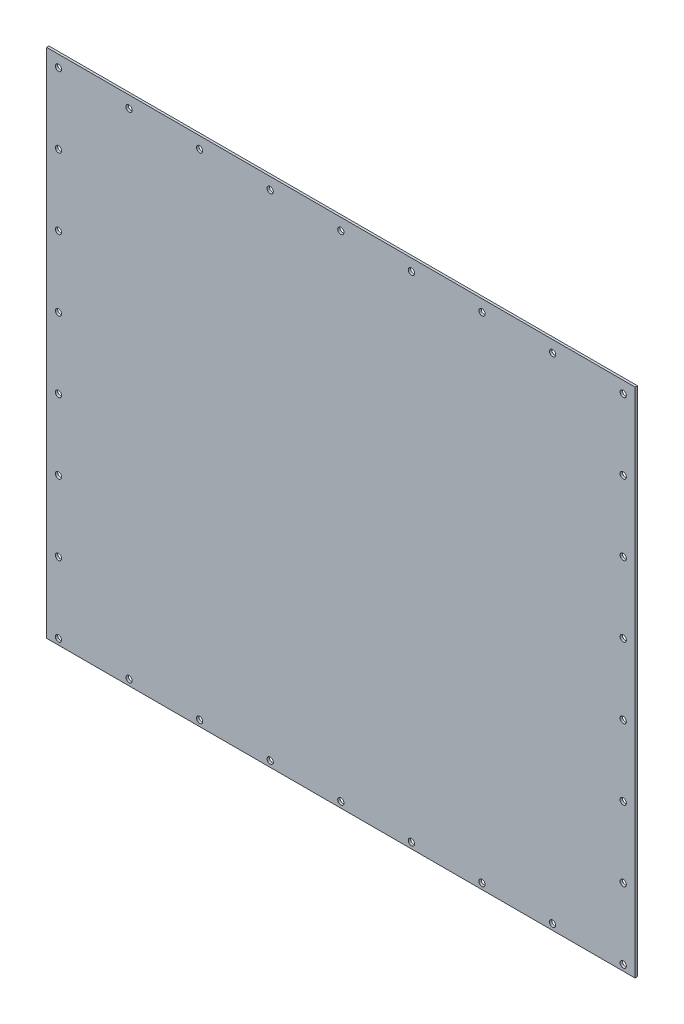
ISO-10303-21;
HEADER;
FILE_DESCRIPTION(('STEP AP214'),'2;1');
FILE_NAME('part.step','',(''),(''),'','','');
FILE_SCHEMA(('AUTOMOTIVE_DESIGN { 1 0 10303 214 1 1 1 1 }'));
ENDSEC;
DATA;
#1=APPLICATION_CONTEXT('core data for automotive mechanical design processes');
#2=APPLICATION_PROTOCOL_DEFINITION('international standard','automotive_design',2000,#1);
#3=PRODUCT_CONTEXT('',#1,'mechanical');
#4=PRODUCT('Part','Part','',(#3));
#5=PRODUCT_RELATED_PRODUCT_CATEGORY('part','',(#4));
#6=PRODUCT_DEFINITION_FORMATION('','',#4);
#7=PRODUCT_DEFINITION_CONTEXT('part definition',#1,'design');
#8=PRODUCT_DEFINITION('design','',#6,#7);
#9=PRODUCT_DEFINITION_SHAPE('','',#8);
#10=(LENGTH_UNIT() NAMED_UNIT(*) SI_UNIT(.MILLI.,.METRE.));
#11=(NAMED_UNIT(*) PLANE_ANGLE_UNIT() SI_UNIT($,.RADIAN.));
#12=(NAMED_UNIT(*) SI_UNIT($,.STERADIAN.) SOLID_ANGLE_UNIT());
#13=UNCERTAINTY_MEASURE_WITH_UNIT(LENGTH_MEASURE(1.E-05),#10,'distance_accuracy_value','');
#14=(GEOMETRIC_REPRESENTATION_CONTEXT(3) GLOBAL_UNCERTAINTY_ASSIGNED_CONTEXT((#13)) GLOBAL_UNIT_ASSIGNED_CONTEXT((#10,
#11,#12)) REPRESENTATION_CONTEXT('',''));
#15=CARTESIAN_POINT('',(0.,0.,0.));
#16=DIRECTION('',(0.,0.,1.));
#17=DIRECTION('',(1.,0.,0.));
#18=AXIS2_PLACEMENT_3D('',#15,#16,#17);
#19=CARTESIAN_POINT('',(240.,175.,1.));
#20=DIRECTION('',(0.,0.,1.));
#21=DIRECTION('',(1.,0.,0.));
#22=AXIS2_PLACEMENT_3D('',#19,#20,#21);
#23=CYLINDRICAL_SURFACE('',#22,2.64999999999999);
#24=CARTESIAN_POINT('',(240.,175.,1.));
#25=DIRECTION('',(0.,0.,1.));
#26=DIRECTION('',(1.,0.,0.));
#27=AXIS2_PLACEMENT_3D('',#24,#25,#26);
#28=CIRCLE('',#27,2.64999999999999);
#29=CARTESIAN_POINT('',(242.65,175.,1.));
#30=VERTEX_POINT('',#29);
#31=EDGE_CURVE('E45',#30,#30,#28,.T.);
#32=ORIENTED_EDGE('',*,*,#31,.T.);
#33=EDGE_LOOP('',(#32));
#34=FACE_BOUND('',#33,.T.);
#35=CARTESIAN_POINT('',(240.,175.,-1.));
#36=DIRECTION('',(0.,0.,1.));
#37=DIRECTION('',(1.,0.,0.));
#38=AXIS2_PLACEMENT_3D('',#35,#36,#37);
#39=CIRCLE('',#38,2.64999999999999);
#40=CARTESIAN_POINT('',(242.65,175.,-1.));
#41=VERTEX_POINT('',#40);
#42=EDGE_CURVE('E11',#41,#41,#39,.T.);
#43=ORIENTED_EDGE('',*,*,#42,.F.);
#44=EDGE_LOOP('',(#43));
#45=FACE_BOUND('',#44,.T.);
#46=ADVANCED_FACE('F37',(#34,#45),#23,.F.);
#47=CARTESIAN_POINT('',(180.,175.,1.));
#48=DIRECTION('',(0.,0.,1.));
#49=DIRECTION('',(1.,0.,0.));
#50=AXIS2_PLACEMENT_3D('',#47,#48,#49);
#51=CYLINDRICAL_SURFACE('',#50,2.64999999999999);
#52=CARTESIAN_POINT('',(180.,175.,1.));
#53=DIRECTION('',(0.,0.,1.));
#54=DIRECTION('',(1.,0.,0.));
#55=AXIS2_PLACEMENT_3D('',#52,#53,#54);
#56=CIRCLE('',#55,2.64999999999999);
#57=CARTESIAN_POINT('',(182.65,175.,1.));
#58=VERTEX_POINT('',#57);
#59=EDGE_CURVE('E174',#58,#58,#56,.T.);
#60=ORIENTED_EDGE('',*,*,#59,.T.);
#61=EDGE_LOOP('',(#60));
#62=FACE_BOUND('',#61,.T.);
#63=CARTESIAN_POINT('',(180.,175.,-1.));
#64=DIRECTION('',(0.,0.,1.));
#65=DIRECTION('',(1.,0.,0.));
#66=AXIS2_PLACEMENT_3D('',#63,#64,#65);
#67=CIRCLE('',#66,2.64999999999999);
#68=CARTESIAN_POINT('',(182.65,175.,-1.));
#69=VERTEX_POINT('',#68);
#70=EDGE_CURVE('E177',#69,#69,#67,.T.);
#71=ORIENTED_EDGE('',*,*,#70,.F.);
#72=EDGE_LOOP('',(#71));
#73=FACE_BOUND('',#72,.T.);
#74=ADVANCED_FACE('F362',(#62,#73),#51,.F.);
#75=CARTESIAN_POINT('',(120.,175.,1.));
#76=DIRECTION('',(0.,0.,1.));
#77=DIRECTION('',(1.,0.,0.));
#78=AXIS2_PLACEMENT_3D('',#75,#76,#77);
#79=CYLINDRICAL_SURFACE('',#78,2.64999999999999);
#80=CARTESIAN_POINT('',(120.,175.,1.));
#81=DIRECTION('',(0.,0.,1.));
#82=DIRECTION('',(1.,0.,0.));
#83=AXIS2_PLACEMENT_3D('',#80,#81,#82);
#84=CIRCLE('',#83,2.64999999999999);
#85=CARTESIAN_POINT('',(122.65,175.,1.));
#86=VERTEX_POINT('',#85);
#87=EDGE_CURVE('E168',#86,#86,#84,.T.);
#88=ORIENTED_EDGE('',*,*,#87,.T.);
#89=EDGE_LOOP('',(#88));
#90=FACE_BOUND('',#89,.T.);
#91=CARTESIAN_POINT('',(120.,175.,-1.));
#92=DIRECTION('',(0.,0.,1.));
#93=DIRECTION('',(1.,0.,0.));
#94=AXIS2_PLACEMENT_3D('',#91,#92,#93);
#95=CIRCLE('',#94,2.64999999999999);
#96=CARTESIAN_POINT('',(122.65,175.,-1.));
#97=VERTEX_POINT('',#96);
#98=EDGE_CURVE('E171',#97,#97,#95,.T.);
#99=ORIENTED_EDGE('',*,*,#98,.F.);
#100=EDGE_LOOP('',(#99));
#101=FACE_BOUND('',#100,.T.);
#102=ADVANCED_FACE('F426',(#90,#101),#79,.F.);
#103=CARTESIAN_POINT('',(60.,175.,1.));
#104=DIRECTION('',(0.,0.,1.));
#105=DIRECTION('',(1.,0.,0.));
#106=AXIS2_PLACEMENT_3D('',#103,#104,#105);
#107=CYLINDRICAL_SURFACE('',#106,2.64999999999999);
#108=CARTESIAN_POINT('',(60.,175.,1.));
#109=DIRECTION('',(0.,0.,1.));
#110=DIRECTION('',(1.,0.,0.));
#111=AXIS2_PLACEMENT_3D('',#108,#109,#110);
#112=CIRCLE('',#111,2.64999999999999);
#113=CARTESIAN_POINT('',(62.65,175.,1.));
#114=VERTEX_POINT('',#113);
#115=EDGE_CURVE('E162',#114,#114,#112,.T.);
#116=ORIENTED_EDGE('',*,*,#115,.T.);
#117=EDGE_LOOP('',(#116));
#118=FACE_BOUND('',#117,.T.);
#119=CARTESIAN_POINT('',(60.,175.,-1.));
#120=DIRECTION('',(0.,0.,1.));
#121=DIRECTION('',(1.,0.,0.));
#122=AXIS2_PLACEMENT_3D('',#119,#120,#121);
#123=CIRCLE('',#122,2.64999999999999);
#124=CARTESIAN_POINT('',(62.65,175.,-1.));
#125=VERTEX_POINT('',#124);
#126=EDGE_CURVE('E165',#125,#125,#123,.T.);
#127=ORIENTED_EDGE('',*,*,#126,.F.);
#128=EDGE_LOOP('',(#127));
#129=FACE_BOUND('',#128,.T.);
#130=ADVANCED_FACE('F422',(#118,#129),#107,.F.);
#131=CARTESIAN_POINT('',(0.,175.,1.));
#132=DIRECTION('',(0.,0.,1.));
#133=DIRECTION('',(1.,0.,0.));
#134=AXIS2_PLACEMENT_3D('',#131,#132,#133);
#135=CYLINDRICAL_SURFACE('',#134,2.64999999999999);
#136=CARTESIAN_POINT('',(0.,175.,1.));
#137=DIRECTION('',(0.,0.,1.));
#138=DIRECTION('',(1.,0.,0.));
#139=AXIS2_PLACEMENT_3D('',#136,#137,#138);
#140=CIRCLE('',#139,2.64999999999999);
#141=CARTESIAN_POINT('',(2.64999999999999,175.,1.));
#142=VERTEX_POINT('',#141);
#143=EDGE_CURVE('E156',#142,#142,#140,.T.);
#144=ORIENTED_EDGE('',*,*,#143,.T.);
#145=EDGE_LOOP('',(#144));
#146=FACE_BOUND('',#145,.T.);
#147=CARTESIAN_POINT('',(0.,175.,-1.));
#148=DIRECTION('',(0.,0.,1.));
#149=DIRECTION('',(1.,0.,0.));
#150=AXIS2_PLACEMENT_3D('',#147,#148,#149);
#151=CIRCLE('',#150,2.64999999999999);
#152=CARTESIAN_POINT('',(2.64999999999999,175.,-1.));
#153=VERTEX_POINT('',#152);
#154=EDGE_CURVE('E159',#153,#153,#151,.T.);
#155=ORIENTED_EDGE('',*,*,#154,.F.);
#156=EDGE_LOOP('',(#155));
#157=FACE_BOUND('',#156,.T.);
#158=ADVANCED_FACE('F418',(#146,#157),#135,.F.);
#159=CARTESIAN_POINT('',(-60.,175.,1.));
#160=DIRECTION('',(0.,0.,1.));
#161=DIRECTION('',(1.,0.,0.));
#162=AXIS2_PLACEMENT_3D('',#159,#160,#161);
#163=CYLINDRICAL_SURFACE('',#162,2.64999999999999);
#164=CARTESIAN_POINT('',(-60.,175.,1.));
#165=DIRECTION('',(0.,0.,1.));
#166=DIRECTION('',(1.,0.,0.));
#167=AXIS2_PLACEMENT_3D('',#164,#165,#166);
#168=CIRCLE('',#167,2.64999999999999);
#169=CARTESIAN_POINT('',(-57.35,175.,1.));
#170=VERTEX_POINT('',#169);
#171=EDGE_CURVE('E150',#170,#170,#168,.T.);
#172=ORIENTED_EDGE('',*,*,#171,.T.);
#173=EDGE_LOOP('',(#172));
#174=FACE_BOUND('',#173,.T.);
#175=CARTESIAN_POINT('',(-60.,175.,-1.));
#176=DIRECTION('',(0.,0.,1.));
#177=DIRECTION('',(1.,0.,0.));
#178=AXIS2_PLACEMENT_3D('',#175,#176,#177);
#179=CIRCLE('',#178,2.64999999999999);
#180=CARTESIAN_POINT('',(-57.35,175.,-1.));
#181=VERTEX_POINT('',#180);
#182=EDGE_CURVE('E153',#181,#181,#179,.T.);
#183=ORIENTED_EDGE('',*,*,#182,.F.);
#184=EDGE_LOOP('',(#183));
#185=FACE_BOUND('',#184,.T.);
#186=ADVANCED_FACE('F414',(#174,#185),#163,.F.);
#187=CARTESIAN_POINT('',(-120.,175.,1.));
#188=DIRECTION('',(0.,0.,1.));
#189=DIRECTION('',(1.,0.,0.));
#190=AXIS2_PLACEMENT_3D('',#187,#188,#189);
#191=CYLINDRICAL_SURFACE('',#190,2.64999999999999);
#192=CARTESIAN_POINT('',(-120.,175.,1.));
#193=DIRECTION('',(0.,0.,1.));
#194=DIRECTION('',(1.,0.,0.));
#195=AXIS2_PLACEMENT_3D('',#192,#193,#194);
#196=CIRCLE('',#195,2.64999999999999);
#197=CARTESIAN_POINT('',(-117.35,175.,1.));
#198=VERTEX_POINT('',#197);
#199=EDGE_CURVE('E144',#198,#198,#196,.T.);
#200=ORIENTED_EDGE('',*,*,#199,.T.);
#201=EDGE_LOOP('',(#200));
#202=FACE_BOUND('',#201,.T.);
#203=CARTESIAN_POINT('',(-120.,175.,-1.));
#204=DIRECTION('',(0.,0.,1.));
#205=DIRECTION('',(1.,0.,0.));
#206=AXIS2_PLACEMENT_3D('',#203,#204,#205);
#207=CIRCLE('',#206,2.64999999999999);
#208=CARTESIAN_POINT('',(-117.35,175.,-1.));
#209=VERTEX_POINT('',#208);
#210=EDGE_CURVE('E147',#209,#209,#207,.T.);
#211=ORIENTED_EDGE('',*,*,#210,.F.);
#212=EDGE_LOOP('',(#211));
#213=FACE_BOUND('',#212,.T.);
#214=ADVANCED_FACE('F410',(#202,#213),#191,.F.);
#215=CARTESIAN_POINT('',(240.,-245.,1.));
#216=DIRECTION('',(0.,0.,1.));
#217=DIRECTION('',(1.,0.,0.));
#218=AXIS2_PLACEMENT_3D('',#215,#216,#217);
#219=CYLINDRICAL_SURFACE('',#218,2.64999999999999);
#220=CARTESIAN_POINT('',(240.,-245.,1.));
#221=DIRECTION('',(0.,0.,1.));
#222=DIRECTION('',(1.,0.,0.));
#223=AXIS2_PLACEMENT_3D('',#220,#221,#222);
#224=CIRCLE('',#223,2.64999999999999);
#225=CARTESIAN_POINT('',(242.65,-245.,1.));
#226=VERTEX_POINT('',#225);
#227=EDGE_CURVE('E138',#226,#226,#224,.T.);
#228=ORIENTED_EDGE('',*,*,#227,.T.);
#229=EDGE_LOOP('',(#228));
#230=FACE_BOUND('',#229,.T.);
#231=CARTESIAN_POINT('',(240.,-245.,-1.));
#232=DIRECTION('',(0.,0.,1.));
#233=DIRECTION('',(1.,0.,0.));
#234=AXIS2_PLACEMENT_3D('',#231,#232,#233);
#235=CIRCLE('',#234,2.64999999999999);
#236=CARTESIAN_POINT('',(242.65,-245.,-1.));
#237=VERTEX_POINT('',#236);
#238=EDGE_CURVE('E141',#237,#237,#235,.T.);
#239=ORIENTED_EDGE('',*,*,#238,.F.);
#240=EDGE_LOOP('',(#239));
#241=FACE_BOUND('',#240,.T.);
#242=ADVANCED_FACE('F406',(#230,#241),#219,.F.);
#243=CARTESIAN_POINT('',(180.,-245.,1.));
#244=DIRECTION('',(0.,0.,1.));
#245=DIRECTION('',(1.,0.,0.));
#246=AXIS2_PLACEMENT_3D('',#243,#244,#245);
#247=CYLINDRICAL_SURFACE('',#246,2.64999999999999);
#248=CARTESIAN_POINT('',(180.,-245.,1.));
#249=DIRECTION('',(0.,0.,1.));
#250=DIRECTION('',(1.,0.,0.));
#251=AXIS2_PLACEMENT_3D('',#248,#249,#250);
#252=CIRCLE('',#251,2.64999999999999);
#253=CARTESIAN_POINT('',(182.65,-245.,1.));
#254=VERTEX_POINT('',#253);
#255=EDGE_CURVE('E132',#254,#254,#252,.T.);
#256=ORIENTED_EDGE('',*,*,#255,.T.);
#257=EDGE_LOOP('',(#256));
#258=FACE_BOUND('',#257,.T.);
#259=CARTESIAN_POINT('',(180.,-245.,-1.));
#260=DIRECTION('',(0.,0.,1.));
#261=DIRECTION('',(1.,0.,0.));
#262=AXIS2_PLACEMENT_3D('',#259,#260,#261);
#263=CIRCLE('',#262,2.64999999999999);
#264=CARTESIAN_POINT('',(182.65,-245.,-1.));
#265=VERTEX_POINT('',#264);
#266=EDGE_CURVE('E135',#265,#265,#263,.T.);
#267=ORIENTED_EDGE('',*,*,#266,.F.);
#268=EDGE_LOOP('',(#267));
#269=FACE_BOUND('',#268,.T.);
#270=ADVANCED_FACE('F402',(#258,#269),#247,.F.);
#271=CARTESIAN_POINT('',(120.,-245.,1.));
#272=DIRECTION('',(0.,0.,1.));
#273=DIRECTION('',(1.,0.,0.));
#274=AXIS2_PLACEMENT_3D('',#271,#272,#273);
#275=CYLINDRICAL_SURFACE('',#274,2.64999999999999);
#276=CARTESIAN_POINT('',(120.,-245.,1.));
#277=DIRECTION('',(0.,0.,1.));
#278=DIRECTION('',(1.,0.,0.));
#279=AXIS2_PLACEMENT_3D('',#276,#277,#278);
#280=CIRCLE('',#279,2.64999999999999);
#281=CARTESIAN_POINT('',(122.65,-245.,1.));
#282=VERTEX_POINT('',#281);
#283=EDGE_CURVE('E126',#282,#282,#280,.T.);
#284=ORIENTED_EDGE('',*,*,#283,.T.);
#285=EDGE_LOOP('',(#284));
#286=FACE_BOUND('',#285,.T.);
#287=CARTESIAN_POINT('',(120.,-245.,-1.));
#288=DIRECTION('',(0.,0.,1.));
#289=DIRECTION('',(1.,0.,0.));
#290=AXIS2_PLACEMENT_3D('',#287,#288,#289);
#291=CIRCLE('',#290,2.64999999999999);
#292=CARTESIAN_POINT('',(122.65,-245.,-1.));
#293=VERTEX_POINT('',#292);
#294=EDGE_CURVE('E129',#293,#293,#291,.T.);
#295=ORIENTED_EDGE('',*,*,#294,.F.);
#296=EDGE_LOOP('',(#295));
#297=FACE_BOUND('',#296,.T.);
#298=ADVANCED_FACE('F398',(#286,#297),#275,.F.);
#299=CARTESIAN_POINT('',(60.,-245.,1.));
#300=DIRECTION('',(0.,0.,1.));
#301=DIRECTION('',(1.,0.,0.));
#302=AXIS2_PLACEMENT_3D('',#299,#300,#301);
#303=CYLINDRICAL_SURFACE('',#302,2.64999999999999);
#304=CARTESIAN_POINT('',(60.,-245.,1.));
#305=DIRECTION('',(0.,0.,1.));
#306=DIRECTION('',(1.,0.,0.));
#307=AXIS2_PLACEMENT_3D('',#304,#305,#306);
#308=CIRCLE('',#307,2.64999999999999);
#309=CARTESIAN_POINT('',(62.65,-245.,1.));
#310=VERTEX_POINT('',#309);
#311=EDGE_CURVE('E120',#310,#310,#308,.T.);
#312=ORIENTED_EDGE('',*,*,#311,.T.);
#313=EDGE_LOOP('',(#312));
#314=FACE_BOUND('',#313,.T.);
#315=CARTESIAN_POINT('',(60.,-245.,-1.));
#316=DIRECTION('',(0.,0.,1.));
#317=DIRECTION('',(1.,0.,0.));
#318=AXIS2_PLACEMENT_3D('',#315,#316,#317);
#319=CIRCLE('',#318,2.64999999999999);
#320=CARTESIAN_POINT('',(62.65,-245.,-1.));
#321=VERTEX_POINT('',#320);
#322=EDGE_CURVE('E123',#321,#321,#319,.T.);
#323=ORIENTED_EDGE('',*,*,#322,.F.);
#324=EDGE_LOOP('',(#323));
#325=FACE_BOUND('',#324,.T.);
#326=ADVANCED_FACE('F394',(#314,#325),#303,.F.);
#327=CARTESIAN_POINT('',(0.,-245.,1.));
#328=DIRECTION('',(0.,0.,1.));
#329=DIRECTION('',(1.,0.,0.));
#330=AXIS2_PLACEMENT_3D('',#327,#328,#329);
#331=CYLINDRICAL_SURFACE('',#330,2.64999999999999);
#332=CARTESIAN_POINT('',(0.,-245.,1.));
#333=DIRECTION('',(0.,0.,1.));
#334=DIRECTION('',(1.,0.,0.));
#335=AXIS2_PLACEMENT_3D('',#332,#333,#334);
#336=CIRCLE('',#335,2.64999999999999);
#337=CARTESIAN_POINT('',(2.65000000000001,-245.,1.));
#338=VERTEX_POINT('',#337);
#339=EDGE_CURVE('E114',#338,#338,#336,.T.);
#340=ORIENTED_EDGE('',*,*,#339,.T.);
#341=EDGE_LOOP('',(#340));
#342=FACE_BOUND('',#341,.T.);
#343=CARTESIAN_POINT('',(0.,-245.,-1.));
#344=DIRECTION('',(0.,0.,1.));
#345=DIRECTION('',(1.,0.,0.));
#346=AXIS2_PLACEMENT_3D('',#343,#344,#345);
#347=CIRCLE('',#346,2.64999999999999);
#348=CARTESIAN_POINT('',(2.65000000000001,-245.,-1.));
#349=VERTEX_POINT('',#348);
#350=EDGE_CURVE('E117',#349,#349,#347,.T.);
#351=ORIENTED_EDGE('',*,*,#350,.F.);
#352=EDGE_LOOP('',(#351));
#353=FACE_BOUND('',#352,.T.);
#354=ADVANCED_FACE('F390',(#342,#353),#331,.F.);
#355=CARTESIAN_POINT('',(-60.,-245.,1.));
#356=DIRECTION('',(0.,0.,1.));
#357=DIRECTION('',(1.,0.,0.));
#358=AXIS2_PLACEMENT_3D('',#355,#356,#357);
#359=CYLINDRICAL_SURFACE('',#358,2.64999999999999);
#360=CARTESIAN_POINT('',(-60.,-245.,1.));
#361=DIRECTION('',(0.,0.,1.));
#362=DIRECTION('',(1.,0.,0.));
#363=AXIS2_PLACEMENT_3D('',#360,#361,#362);
#364=CIRCLE('',#363,2.64999999999999);
#365=CARTESIAN_POINT('',(-57.35,-245.,1.));
#366=VERTEX_POINT('',#365);
#367=EDGE_CURVE('E108',#366,#366,#364,.T.);
#368=ORIENTED_EDGE('',*,*,#367,.T.);
#369=EDGE_LOOP('',(#368));
#370=FACE_BOUND('',#369,.T.);
#371=CARTESIAN_POINT('',(-60.,-245.,-1.));
#372=DIRECTION('',(0.,0.,1.));
#373=DIRECTION('',(1.,0.,0.));
#374=AXIS2_PLACEMENT_3D('',#371,#372,#373);
#375=CIRCLE('',#374,2.64999999999999);
#376=CARTESIAN_POINT('',(-57.35,-245.,-1.));
#377=VERTEX_POINT('',#376);
#378=EDGE_CURVE('E111',#377,#377,#375,.T.);
#379=ORIENTED_EDGE('',*,*,#378,.F.);
#380=EDGE_LOOP('',(#379));
#381=FACE_BOUND('',#380,.T.);
#382=ADVANCED_FACE('F386',(#370,#381),#359,.F.);
#383=CARTESIAN_POINT('',(-120.,-245.,1.));
#384=DIRECTION('',(0.,0.,1.));
#385=DIRECTION('',(1.,0.,0.));
#386=AXIS2_PLACEMENT_3D('',#383,#384,#385);
#387=CYLINDRICAL_SURFACE('',#386,2.64999999999999);
#388=CARTESIAN_POINT('',(-120.,-245.,1.));
#389=DIRECTION('',(0.,0.,1.));
#390=DIRECTION('',(1.,0.,0.));
#391=AXIS2_PLACEMENT_3D('',#388,#389,#390);
#392=CIRCLE('',#391,2.64999999999999);
#393=CARTESIAN_POINT('',(-117.35,-245.,1.));
#394=VERTEX_POINT('',#393);
#395=EDGE_CURVE('E102',#394,#394,#392,.T.);
#396=ORIENTED_EDGE('',*,*,#395,.T.);
#397=EDGE_LOOP('',(#396));
#398=FACE_BOUND('',#397,.T.);
#399=CARTESIAN_POINT('',(-120.,-245.,-1.));
#400=DIRECTION('',(0.,0.,1.));
#401=DIRECTION('',(1.,0.,0.));
#402=AXIS2_PLACEMENT_3D('',#399,#400,#401);
#403=CIRCLE('',#402,2.64999999999999);
#404=CARTESIAN_POINT('',(-117.35,-245.,-1.));
#405=VERTEX_POINT('',#404);
#406=EDGE_CURVE('E105',#405,#405,#403,.T.);
#407=ORIENTED_EDGE('',*,*,#406,.F.);
#408=EDGE_LOOP('',(#407));
#409=FACE_BOUND('',#408,.T.);
#410=ADVANCED_FACE('F383',(#398,#409),#387,.F.);
#411=CARTESIAN_POINT('',(-250.,-250.,1.));
#412=DIRECTION('',(1.,0.,0.));
#413=DIRECTION('',(0.,0.,-1.));
#414=AXIS2_PLACEMENT_3D('',#411,#412,#413);
#415=PLANE('',#414);
#416=DIRECTION('',(0.,-1.,0.));
#417=VECTOR('',#416,1.);
#418=CARTESIAN_POINT('',(-250.,-250.,1.));
#419=LINE('',#418,#417);
#420=CARTESIAN_POINT('',(-250.,185.,1.));
#421=VERTEX_POINT('',#420);
#422=CARTESIAN_POINT('',(-250.,-250.,1.));
#423=VERTEX_POINT('',#422);
#424=EDGE_CURVE('E96',#421,#423,#419,.T.);
#425=ORIENTED_EDGE('',*,*,#424,.F.);
#426=DIRECTION('',(0.,0.,1.));
#427=VECTOR('',#426,1.);
#428=CARTESIAN_POINT('',(-250.,185.,-505.207298638169));
#429=LINE('',#428,#427);
#430=CARTESIAN_POINT('',(-250.,185.,-1.));
#431=VERTEX_POINT('',#430);
#432=EDGE_CURVE('E267',#431,#421,#429,.T.);
#433=ORIENTED_EDGE('',*,*,#432,.F.);
#434=DIRECTION('',(0.,-1.,0.));
#435=VECTOR('',#434,1.);
#436=CARTESIAN_POINT('',(-250.,-250.,-1.));
#437=LINE('',#436,#435);
#438=CARTESIAN_POINT('',(-250.,-250.,-1.));
#439=VERTEX_POINT('',#438);
#440=EDGE_CURVE('E86',#431,#439,#437,.T.);
#441=ORIENTED_EDGE('',*,*,#440,.T.);
#442=DIRECTION('',(0.,0.,-1.));
#443=VECTOR('',#442,1.);
#444=CARTESIAN_POINT('',(-250.,-250.,1.));
#445=LINE('',#444,#443);
#446=EDGE_CURVE('E81',#423,#439,#445,.T.);
#447=ORIENTED_EDGE('',*,*,#446,.F.);
#448=EDGE_LOOP('',(#425,#433,#441,#447));
#449=FACE_BOUND('',#448,.T.);
#450=ADVANCED_FACE('F265',(#449),#415,.F.);
#451=CARTESIAN_POINT('',(250.,-250.,1.));
#452=DIRECTION('',(0.,1.,0.));
#453=DIRECTION('',(-1.,0.,0.));
#454=AXIS2_PLACEMENT_3D('',#451,#452,#453);
#455=PLANE('',#454);
#456=DIRECTION('',(1.,0.,0.));
#457=VECTOR('',#456,1.);
#458=CARTESIAN_POINT('',(250.,-250.,-1.));
#459=LINE('',#458,#457);
#460=CARTESIAN_POINT('',(250.,-250.,-1.));
#461=VERTEX_POINT('',#460);
#462=EDGE_CURVE('E75',#439,#461,#459,.T.);
#463=ORIENTED_EDGE('',*,*,#462,.T.);
#464=DIRECTION('',(0.,0.,-1.));
#465=VECTOR('',#464,1.);
#466=CARTESIAN_POINT('',(250.,-250.,1.));
#467=LINE('',#466,#465);
#468=CARTESIAN_POINT('',(250.,-250.,1.));
#469=VERTEX_POINT('',#468);
#470=EDGE_CURVE('E78',#469,#461,#467,.T.);
#471=ORIENTED_EDGE('',*,*,#470,.F.);
#472=DIRECTION('',(1.,0.,0.));
#473=VECTOR('',#472,1.);
#474=CARTESIAN_POINT('',(250.,-250.,1.));
#475=LINE('',#474,#473);
#476=EDGE_CURVE('E62',#423,#469,#475,.T.);
#477=ORIENTED_EDGE('',*,*,#476,.F.);
#478=ORIENTED_EDGE('',*,*,#446,.T.);
#479=EDGE_LOOP('',(#463,#471,#477,#478));
#480=FACE_BOUND('',#479,.T.);
#481=ADVANCED_FACE('F77',(#480),#455,.F.);
#482=CARTESIAN_POINT('',(250.,-250.,1.));
#483=DIRECTION('',(-1.,0.,0.));
#484=DIRECTION('',(0.,-1.,0.));
#485=AXIS2_PLACEMENT_3D('',#482,#483,#484);
#486=PLANE('',#485);
#487=DIRECTION('',(0.,1.,0.));
#488=VECTOR('',#487,1.);
#489=CARTESIAN_POINT('',(250.,-250.,-1.));
#490=LINE('',#489,#488);
#491=CARTESIAN_POINT('',(250.,185.,-1.));
#492=VERTEX_POINT('',#491);
#493=EDGE_CURVE('E85',#461,#492,#490,.T.);
#494=ORIENTED_EDGE('',*,*,#493,.T.);
#495=DIRECTION('',(0.,0.,1.));
#496=VECTOR('',#495,1.);
#497=CARTESIAN_POINT('',(250.,185.,-505.207298638169));
#498=LINE('',#497,#496);
#499=CARTESIAN_POINT('',(250.,185.,1.));
#500=VERTEX_POINT('',#499);
#501=EDGE_CURVE('E53',#492,#500,#498,.T.);
#502=ORIENTED_EDGE('',*,*,#501,.T.);
#503=DIRECTION('',(0.,1.,0.));
#504=VECTOR('',#503,1.);
#505=CARTESIAN_POINT('',(250.,-250.,1.));
#506=LINE('',#505,#504);
#507=EDGE_CURVE('E91',#469,#500,#506,.T.);
#508=ORIENTED_EDGE('',*,*,#507,.F.);
#509=ORIENTED_EDGE('',*,*,#470,.T.);
#510=EDGE_LOOP('',(#494,#502,#508,#509));
#511=FACE_BOUND('',#510,.T.);
#512=ADVANCED_FACE('F90',(#511),#486,.F.);
#513=CARTESIAN_POINT('',(0.,0.,1.));
#514=DIRECTION('',(0.,0.,1.));
#515=DIRECTION('',(1.,0.,0.));
#516=AXIS2_PLACEMENT_3D('',#513,#514,#515);
#517=PLANE('',#516);
#518=DIRECTION('',(1.,0.,0.));
#519=VECTOR('',#518,1.);
#520=CARTESIAN_POINT('',(-250.,185.,1.));
#521=LINE('',#520,#519);
#522=EDGE_CURVE('E274',#421,#500,#521,.T.);
#523=ORIENTED_EDGE('',*,*,#522,.F.);
#524=ORIENTED_EDGE('',*,*,#424,.T.);
#525=ORIENTED_EDGE('',*,*,#476,.T.);
#526=ORIENTED_EDGE('',*,*,#507,.T.);
#527=EDGE_LOOP('',(#523,#524,#525,#526));
#528=FACE_BOUND('',#527,.T.);
#529=CARTESIAN_POINT('',(240.,-185.,1.));
#530=DIRECTION('',(0.,0.,1.));
#531=DIRECTION('',(1.,0.,0.));
#532=AXIS2_PLACEMENT_3D('',#529,#530,#531);
#533=CIRCLE('',#532,2.64999999999999);
#534=CARTESIAN_POINT('',(242.65,-185.,1.));
#535=VERTEX_POINT('',#534);
#536=EDGE_CURVE('E282',#535,#535,#533,.T.);
#537=ORIENTED_EDGE('',*,*,#536,.F.);
#538=EDGE_LOOP('',(#537));
#539=FACE_BOUND('',#538,.T.);
#540=CARTESIAN_POINT('',(240.,-125.,1.));
#541=DIRECTION('',(0.,0.,1.));
#542=DIRECTION('',(1.,0.,0.));
#543=AXIS2_PLACEMENT_3D('',#540,#541,#542);
#544=CIRCLE('',#543,2.64999999999999);
#545=CARTESIAN_POINT('',(242.65,-125.,1.));
#546=VERTEX_POINT('',#545);
#547=EDGE_CURVE('E288',#546,#546,#544,.T.);
#548=ORIENTED_EDGE('',*,*,#547,.F.);
#549=EDGE_LOOP('',(#548));
#550=FACE_BOUND('',#549,.T.);
#551=CARTESIAN_POINT('',(240.,-65.,1.));
#552=DIRECTION('',(0.,0.,1.));
#553=DIRECTION('',(1.,0.,0.));
#554=AXIS2_PLACEMENT_3D('',#551,#552,#553);
#555=CIRCLE('',#554,2.64999999999999);
#556=CARTESIAN_POINT('',(242.65,-65.,1.));
#557=VERTEX_POINT('',#556);
#558=EDGE_CURVE('E294',#557,#557,#555,.T.);
#559=ORIENTED_EDGE('',*,*,#558,.F.);
#560=EDGE_LOOP('',(#559));
#561=FACE_BOUND('',#560,.T.);
#562=CARTESIAN_POINT('',(240.,-5.,1.));
#563=DIRECTION('',(0.,0.,1.));
#564=DIRECTION('',(1.,0.,0.));
#565=AXIS2_PLACEMENT_3D('',#562,#563,#564);
#566=CIRCLE('',#565,2.64999999999999);
#567=CARTESIAN_POINT('',(242.65,-5.,1.));
#568=VERTEX_POINT('',#567);
#569=EDGE_CURVE('E207',#568,#568,#566,.T.);
#570=ORIENTED_EDGE('',*,*,#569,.F.);
#571=EDGE_LOOP('',(#570));
#572=FACE_BOUND('',#571,.T.);
#573=CARTESIAN_POINT('',(240.,55.,1.));
#574=DIRECTION('',(0.,0.,1.));
#575=DIRECTION('',(1.,0.,0.));
#576=AXIS2_PLACEMENT_3D('',#573,#574,#575);
#577=CIRCLE('',#576,2.64999999999999);
#578=CARTESIAN_POINT('',(242.65,55.,1.));
#579=VERTEX_POINT('',#578);
#580=EDGE_CURVE('E197',#579,#579,#577,.T.);
#581=ORIENTED_EDGE('',*,*,#580,.F.);
#582=EDGE_LOOP('',(#581));
#583=FACE_BOUND('',#582,.T.);
#584=CARTESIAN_POINT('',(240.,115.,1.));
#585=DIRECTION('',(0.,0.,1.));
#586=DIRECTION('',(1.,0.,0.));
#587=AXIS2_PLACEMENT_3D('',#584,#585,#586);
#588=CIRCLE('',#587,2.64999999999999);
#589=CARTESIAN_POINT('',(242.65,115.,1.));
#590=VERTEX_POINT('',#589);
#591=EDGE_CURVE('E194',#590,#590,#588,.T.);
#592=ORIENTED_EDGE('',*,*,#591,.F.);
#593=EDGE_LOOP('',(#592));
#594=FACE_BOUND('',#593,.T.);
#595=CARTESIAN_POINT('',(-240.,-185.,1.));
#596=DIRECTION('',(0.,0.,1.));
#597=DIRECTION('',(1.,0.,0.));
#598=AXIS2_PLACEMENT_3D('',#595,#596,#597);
#599=CIRCLE('',#598,2.64999999999999);
#600=CARTESIAN_POINT('',(-237.35,-185.,1.));
#601=VERTEX_POINT('',#600);
#602=EDGE_CURVE('E193',#601,#601,#599,.T.);
#603=ORIENTED_EDGE('',*,*,#602,.F.);
#604=EDGE_LOOP('',(#603));
#605=FACE_BOUND('',#604,.T.);
#606=CARTESIAN_POINT('',(-240.,-125.,1.));
#607=DIRECTION('',(0.,0.,1.));
#608=DIRECTION('',(1.,0.,0.));
#609=AXIS2_PLACEMENT_3D('',#606,#607,#608);
#610=CIRCLE('',#609,2.64999999999999);
#611=CARTESIAN_POINT('',(-237.35,-125.,1.));
#612=VERTEX_POINT('',#611);
#613=EDGE_CURVE('E216',#612,#612,#610,.T.);
#614=ORIENTED_EDGE('',*,*,#613,.F.);
#615=EDGE_LOOP('',(#614));
#616=FACE_BOUND('',#615,.T.);
#617=CARTESIAN_POINT('',(-240.,-65.,1.));
#618=DIRECTION('',(0.,0.,1.));
#619=DIRECTION('',(1.,0.,0.));
#620=AXIS2_PLACEMENT_3D('',#617,#618,#619);
#621=CIRCLE('',#620,2.64999999999999);
#622=CARTESIAN_POINT('',(-237.35,-65.,1.));
#623=VERTEX_POINT('',#622);
#624=EDGE_CURVE('E222',#623,#623,#621,.T.);
#625=ORIENTED_EDGE('',*,*,#624,.F.);
#626=EDGE_LOOP('',(#625));
#627=FACE_BOUND('',#626,.T.);
#628=CARTESIAN_POINT('',(-240.,-5.,1.));
#629=DIRECTION('',(0.,0.,1.));
#630=DIRECTION('',(1.,0.,0.));
#631=AXIS2_PLACEMENT_3D('',#628,#629,#630);
#632=CIRCLE('',#631,2.64999999999999);
#633=CARTESIAN_POINT('',(-237.35,-5.,1.));
#634=VERTEX_POINT('',#633);
#635=EDGE_CURVE('E190',#634,#634,#632,.T.);
#636=ORIENTED_EDGE('',*,*,#635,.F.);
#637=EDGE_LOOP('',(#636));
#638=FACE_BOUND('',#637,.T.);
#639=CARTESIAN_POINT('',(-240.,55.,1.));
#640=DIRECTION('',(0.,0.,1.));
#641=DIRECTION('',(1.,0.,0.));
#642=AXIS2_PLACEMENT_3D('',#639,#640,#641);
#643=CIRCLE('',#642,2.64999999999999);
#644=CARTESIAN_POINT('',(-237.35,55.,1.));
#645=VERTEX_POINT('',#644);
#646=EDGE_CURVE('E186',#645,#645,#643,.T.);
#647=ORIENTED_EDGE('',*,*,#646,.F.);
#648=EDGE_LOOP('',(#647));
#649=FACE_BOUND('',#648,.T.);
#650=CARTESIAN_POINT('',(-240.,115.,1.));
#651=DIRECTION('',(0.,0.,1.));
#652=DIRECTION('',(1.,0.,0.));
#653=AXIS2_PLACEMENT_3D('',#650,#651,#652);
#654=CIRCLE('',#653,2.64999999999999);
#655=CARTESIAN_POINT('',(-237.35,115.,1.));
#656=VERTEX_POINT('',#655);
#657=EDGE_CURVE('E185',#656,#656,#654,.T.);
#658=ORIENTED_EDGE('',*,*,#657,.F.);
#659=EDGE_LOOP('',(#658));
#660=FACE_BOUND('',#659,.T.);
#661=CARTESIAN_POINT('',(-180.,175.,1.));
#662=DIRECTION('',(0.,0.,1.));
#663=DIRECTION('',(1.,0.,0.));
#664=AXIS2_PLACEMENT_3D('',#661,#662,#663);
#665=CIRCLE('',#664,2.64999999999999);
#666=CARTESIAN_POINT('',(-177.35,175.,1.));
#667=VERTEX_POINT('',#666);
#668=EDGE_CURVE('E237',#667,#667,#665,.T.);
#669=ORIENTED_EDGE('',*,*,#668,.F.);
#670=EDGE_LOOP('',(#669));
#671=FACE_BOUND('',#670,.T.);
#672=CARTESIAN_POINT('',(-240.,175.,1.));
#673=DIRECTION('',(0.,0.,1.));
#674=DIRECTION('',(1.,0.,0.));
#675=AXIS2_PLACEMENT_3D('',#672,#673,#674);
#676=CIRCLE('',#675,2.64999999999999);
#677=CARTESIAN_POINT('',(-237.35,175.,1.));
#678=VERTEX_POINT('',#677);
#679=EDGE_CURVE('E243',#678,#678,#676,.T.);
#680=ORIENTED_EDGE('',*,*,#679,.F.);
#681=EDGE_LOOP('',(#680));
#682=FACE_BOUND('',#681,.T.);
#683=CARTESIAN_POINT('',(-180.,-245.,1.));
#684=DIRECTION('',(0.,0.,1.));
#685=DIRECTION('',(1.,0.,0.));
#686=AXIS2_PLACEMENT_3D('',#683,#684,#685);
#687=CIRCLE('',#686,2.64999999999999);
#688=CARTESIAN_POINT('',(-177.35,-245.,1.));
#689=VERTEX_POINT('',#688);
#690=EDGE_CURVE('E249',#689,#689,#687,.T.);
#691=ORIENTED_EDGE('',*,*,#690,.F.);
#692=EDGE_LOOP('',(#691));
#693=FACE_BOUND('',#692,.T.);
#694=CARTESIAN_POINT('',(-240.,-245.,1.));
#695=DIRECTION('',(0.,0.,1.));
#696=DIRECTION('',(1.,0.,0.));
#697=AXIS2_PLACEMENT_3D('',#694,#695,#696);
#698=CIRCLE('',#697,2.64999999999999);
#699=CARTESIAN_POINT('',(-237.35,-245.,1.));
#700=VERTEX_POINT('',#699);
#701=EDGE_CURVE('E255',#700,#700,#698,.T.);
#702=ORIENTED_EDGE('',*,*,#701,.F.);
#703=EDGE_LOOP('',(#702));
#704=FACE_BOUND('',#703,.T.);
#705=ORIENTED_EDGE('',*,*,#395,.F.);
#706=EDGE_LOOP('',(#705));
#707=FACE_BOUND('',#706,.T.);
#708=ORIENTED_EDGE('',*,*,#367,.F.);
#709=EDGE_LOOP('',(#708));
#710=FACE_BOUND('',#709,.T.);
#711=ORIENTED_EDGE('',*,*,#339,.F.);
#712=EDGE_LOOP('',(#711));
#713=FACE_BOUND('',#712,.T.);
#714=ORIENTED_EDGE('',*,*,#311,.F.);
#715=EDGE_LOOP('',(#714));
#716=FACE_BOUND('',#715,.T.);
#717=ORIENTED_EDGE('',*,*,#283,.F.);
#718=EDGE_LOOP('',(#717));
#719=FACE_BOUND('',#718,.T.);
#720=ORIENTED_EDGE('',*,*,#255,.F.);
#721=EDGE_LOOP('',(#720));
#722=FACE_BOUND('',#721,.T.);
#723=ORIENTED_EDGE('',*,*,#227,.F.);
#724=EDGE_LOOP('',(#723));
#725=FACE_BOUND('',#724,.T.);
#726=ORIENTED_EDGE('',*,*,#199,.F.);
#727=EDGE_LOOP('',(#726));
#728=FACE_BOUND('',#727,.T.);
#729=ORIENTED_EDGE('',*,*,#171,.F.);
#730=EDGE_LOOP('',(#729));
#731=FACE_BOUND('',#730,.T.);
#732=ORIENTED_EDGE('',*,*,#143,.F.);
#733=EDGE_LOOP('',(#732));
#734=FACE_BOUND('',#733,.T.);
#735=ORIENTED_EDGE('',*,*,#115,.F.);
#736=EDGE_LOOP('',(#735));
#737=FACE_BOUND('',#736,.T.);
#738=ORIENTED_EDGE('',*,*,#87,.F.);
#739=EDGE_LOOP('',(#738));
#740=FACE_BOUND('',#739,.T.);
#741=ORIENTED_EDGE('',*,*,#59,.F.);
#742=EDGE_LOOP('',(#741));
#743=FACE_BOUND('',#742,.T.);
#744=ORIENTED_EDGE('',*,*,#31,.F.);
#745=EDGE_LOOP('',(#744));
#746=FACE_BOUND('',#745,.T.);
#747=ADVANCED_FACE('F276',(#528,#539,#550,#561,#572,#583,#594,#605,#616,#627,#638,#649,#660,
#671,#682,#693,#704,#707,#710,#713,#716,#719,#722,#725,#728,#731,#734,#737,#740,#743,#746),#517,.T.);
#748=CARTESIAN_POINT('',(0.,0.,-1.));
#749=DIRECTION('',(0.,0.,1.));
#750=DIRECTION('',(1.,0.,0.));
#751=AXIS2_PLACEMENT_3D('',#748,#749,#750);
#752=PLANE('',#751);
#753=CARTESIAN_POINT('',(240.,-185.,-1.));
#754=DIRECTION('',(0.,0.,1.));
#755=DIRECTION('',(1.,0.,0.));
#756=AXIS2_PLACEMENT_3D('',#753,#754,#755);
#757=CIRCLE('',#756,2.64999999999999);
#758=CARTESIAN_POINT('',(242.65,-185.,-1.));
#759=VERTEX_POINT('',#758);
#760=EDGE_CURVE('E285',#759,#759,#757,.T.);
#761=ORIENTED_EDGE('',*,*,#760,.T.);
#762=EDGE_LOOP('',(#761));
#763=FACE_BOUND('',#762,.T.);
#764=CARTESIAN_POINT('',(240.,-125.,-1.));
#765=DIRECTION('',(0.,0.,1.));
#766=DIRECTION('',(1.,0.,0.));
#767=AXIS2_PLACEMENT_3D('',#764,#765,#766);
#768=CIRCLE('',#767,2.64999999999999);
#769=CARTESIAN_POINT('',(242.65,-125.,-1.));
#770=VERTEX_POINT('',#769);
#771=EDGE_CURVE('E291',#770,#770,#768,.T.);
#772=ORIENTED_EDGE('',*,*,#771,.T.);
#773=EDGE_LOOP('',(#772));
#774=FACE_BOUND('',#773,.T.);
#775=CARTESIAN_POINT('',(240.,-65.,-1.));
#776=DIRECTION('',(0.,0.,1.));
#777=DIRECTION('',(1.,0.,0.));
#778=AXIS2_PLACEMENT_3D('',#775,#776,#777);
#779=CIRCLE('',#778,2.64999999999999);
#780=CARTESIAN_POINT('',(242.65,-65.,-1.));
#781=VERTEX_POINT('',#780);
#782=EDGE_CURVE('E296',#781,#781,#779,.T.);
#783=ORIENTED_EDGE('',*,*,#782,.T.);
#784=EDGE_LOOP('',(#783));
#785=FACE_BOUND('',#784,.T.);
#786=CARTESIAN_POINT('',(240.,-5.,-1.));
#787=DIRECTION('',(0.,0.,1.));
#788=DIRECTION('',(1.,0.,0.));
#789=AXIS2_PLACEMENT_3D('',#786,#787,#788);
#790=CIRCLE('',#789,2.64999999999999);
#791=CARTESIAN_POINT('',(242.65,-5.,-1.));
#792=VERTEX_POINT('',#791);
#793=EDGE_CURVE('E40',#792,#792,#790,.T.);
#794=ORIENTED_EDGE('',*,*,#793,.T.);
#795=EDGE_LOOP('',(#794));
#796=FACE_BOUND('',#795,.T.);
#797=CARTESIAN_POINT('',(240.,55.,-1.));
#798=DIRECTION('',(0.,0.,1.));
#799=DIRECTION('',(1.,0.,0.));
#800=AXIS2_PLACEMENT_3D('',#797,#798,#799);
#801=CIRCLE('',#800,2.64999999999999);
#802=CARTESIAN_POINT('',(242.65,55.,-1.));
#803=VERTEX_POINT('',#802);
#804=EDGE_CURVE('E195',#803,#803,#801,.T.);
#805=ORIENTED_EDGE('',*,*,#804,.T.);
#806=EDGE_LOOP('',(#805));
#807=FACE_BOUND('',#806,.T.);
#808=CARTESIAN_POINT('',(240.,115.,-1.));
#809=DIRECTION('',(0.,0.,1.));
#810=DIRECTION('',(1.,0.,0.));
#811=AXIS2_PLACEMENT_3D('',#808,#809,#810);
#812=CIRCLE('',#811,2.64999999999999);
#813=CARTESIAN_POINT('',(242.65,115.,-1.));
#814=VERTEX_POINT('',#813);
#815=EDGE_CURVE('E191',#814,#814,#812,.T.);
#816=ORIENTED_EDGE('',*,*,#815,.T.);
#817=EDGE_LOOP('',(#816));
#818=FACE_BOUND('',#817,.T.);
#819=CARTESIAN_POINT('',(-240.,-185.,-1.));
#820=DIRECTION('',(0.,0.,1.));
#821=DIRECTION('',(1.,0.,0.));
#822=AXIS2_PLACEMENT_3D('',#819,#820,#821);
#823=CIRCLE('',#822,2.64999999999999);
#824=CARTESIAN_POINT('',(-237.35,-185.,-1.));
#825=VERTEX_POINT('',#824);
#826=EDGE_CURVE('E213',#825,#825,#823,.T.);
#827=ORIENTED_EDGE('',*,*,#826,.T.);
#828=EDGE_LOOP('',(#827));
#829=FACE_BOUND('',#828,.T.);
#830=CARTESIAN_POINT('',(-240.,-125.,-1.));
#831=DIRECTION('',(0.,0.,1.));
#832=DIRECTION('',(1.,0.,0.));
#833=AXIS2_PLACEMENT_3D('',#830,#831,#832);
#834=CIRCLE('',#833,2.64999999999999);
#835=CARTESIAN_POINT('',(-237.35,-125.,-1.));
#836=VERTEX_POINT('',#835);
#837=EDGE_CURVE('E219',#836,#836,#834,.T.);
#838=ORIENTED_EDGE('',*,*,#837,.T.);
#839=EDGE_LOOP('',(#838));
#840=FACE_BOUND('',#839,.T.);
#841=CARTESIAN_POINT('',(-240.,-65.,-1.));
#842=DIRECTION('',(0.,0.,1.));
#843=DIRECTION('',(1.,0.,0.));
#844=AXIS2_PLACEMENT_3D('',#841,#842,#843);
#845=CIRCLE('',#844,2.64999999999999);
#846=CARTESIAN_POINT('',(-237.35,-65.,-1.));
#847=VERTEX_POINT('',#846);
#848=EDGE_CURVE('E225',#847,#847,#845,.T.);
#849=ORIENTED_EDGE('',*,*,#848,.T.);
#850=EDGE_LOOP('',(#849));
#851=FACE_BOUND('',#850,.T.);
#852=CARTESIAN_POINT('',(-240.,-5.,-1.));
#853=DIRECTION('',(0.,0.,1.));
#854=DIRECTION('',(1.,0.,0.));
#855=AXIS2_PLACEMENT_3D('',#852,#853,#854);
#856=CIRCLE('',#855,2.64999999999999);
#857=CARTESIAN_POINT('',(-237.35,-5.,-1.));
#858=VERTEX_POINT('',#857);
#859=EDGE_CURVE('E187',#858,#858,#856,.T.);
#860=ORIENTED_EDGE('',*,*,#859,.T.);
#861=EDGE_LOOP('',(#860));
#862=FACE_BOUND('',#861,.T.);
#863=CARTESIAN_POINT('',(-240.,55.,-1.));
#864=DIRECTION('',(0.,0.,1.));
#865=DIRECTION('',(1.,0.,0.));
#866=AXIS2_PLACEMENT_3D('',#863,#864,#865);
#867=CIRCLE('',#866,2.64999999999999);
#868=CARTESIAN_POINT('',(-237.35,55.,-1.));
#869=VERTEX_POINT('',#868);
#870=EDGE_CURVE('E182',#869,#869,#867,.T.);
#871=ORIENTED_EDGE('',*,*,#870,.T.);
#872=EDGE_LOOP('',(#871));
#873=FACE_BOUND('',#872,.T.);
#874=CARTESIAN_POINT('',(-240.,115.,-1.));
#875=DIRECTION('',(0.,0.,1.));
#876=DIRECTION('',(1.,0.,0.));
#877=AXIS2_PLACEMENT_3D('',#874,#875,#876);
#878=CIRCLE('',#877,2.64999999999999);
#879=CARTESIAN_POINT('',(-237.35,115.,-1.));
#880=VERTEX_POINT('',#879);
#881=EDGE_CURVE('E234',#880,#880,#878,.T.);
#882=ORIENTED_EDGE('',*,*,#881,.T.);
#883=EDGE_LOOP('',(#882));
#884=FACE_BOUND('',#883,.T.);
#885=CARTESIAN_POINT('',(-180.,175.,-1.));
#886=DIRECTION('',(0.,0.,1.));
#887=DIRECTION('',(1.,0.,0.));
#888=AXIS2_PLACEMENT_3D('',#885,#886,#887);
#889=CIRCLE('',#888,2.64999999999999);
#890=CARTESIAN_POINT('',(-177.35,175.,-1.));
#891=VERTEX_POINT('',#890);
#892=EDGE_CURVE('E240',#891,#891,#889,.T.);
#893=ORIENTED_EDGE('',*,*,#892,.T.);
#894=EDGE_LOOP('',(#893));
#895=FACE_BOUND('',#894,.T.);
#896=CARTESIAN_POINT('',(-240.,175.,-1.));
#897=DIRECTION('',(0.,0.,1.));
#898=DIRECTION('',(1.,0.,0.));
#899=AXIS2_PLACEMENT_3D('',#896,#897,#898);
#900=CIRCLE('',#899,2.64999999999999);
#901=CARTESIAN_POINT('',(-237.35,175.,-1.));
#902=VERTEX_POINT('',#901);
#903=EDGE_CURVE('E246',#902,#902,#900,.T.);
#904=ORIENTED_EDGE('',*,*,#903,.T.);
#905=EDGE_LOOP('',(#904));
#906=FACE_BOUND('',#905,.T.);
#907=CARTESIAN_POINT('',(-180.,-245.,-1.));
#908=DIRECTION('',(0.,0.,1.));
#909=DIRECTION('',(1.,0.,0.));
#910=AXIS2_PLACEMENT_3D('',#907,#908,#909);
#911=CIRCLE('',#910,2.64999999999999);
#912=CARTESIAN_POINT('',(-177.35,-245.,-1.));
#913=VERTEX_POINT('',#912);
#914=EDGE_CURVE('E252',#913,#913,#911,.T.);
#915=ORIENTED_EDGE('',*,*,#914,.T.);
#916=EDGE_LOOP('',(#915));
#917=FACE_BOUND('',#916,.T.);
#918=CARTESIAN_POINT('',(-240.,-245.,-1.));
#919=DIRECTION('',(0.,0.,1.));
#920=DIRECTION('',(1.,0.,0.));
#921=AXIS2_PLACEMENT_3D('',#918,#919,#920);
#922=CIRCLE('',#921,2.64999999999999);
#923=CARTESIAN_POINT('',(-237.35,-245.,-1.));
#924=VERTEX_POINT('',#923);
#925=EDGE_CURVE('E258',#924,#924,#922,.T.);
#926=ORIENTED_EDGE('',*,*,#925,.T.);
#927=EDGE_LOOP('',(#926));
#928=FACE_BOUND('',#927,.T.);
#929=ORIENTED_EDGE('',*,*,#440,.F.);
#930=DIRECTION('',(-1.,0.,0.));
#931=VECTOR('',#930,1.);
#932=CARTESIAN_POINT('',(-250.,185.,-1.));
#933=LINE('',#932,#931);
#934=EDGE_CURVE('E95',#492,#431,#933,.T.);
#935=ORIENTED_EDGE('',*,*,#934,.F.);
#936=ORIENTED_EDGE('',*,*,#493,.F.);
#937=ORIENTED_EDGE('',*,*,#462,.F.);
#938=EDGE_LOOP('',(#929,#935,#936,#937));
#939=FACE_BOUND('',#938,.T.);
#940=ORIENTED_EDGE('',*,*,#406,.T.);
#941=EDGE_LOOP('',(#940));
#942=FACE_BOUND('',#941,.T.);
#943=ORIENTED_EDGE('',*,*,#378,.T.);
#944=EDGE_LOOP('',(#943));
#945=FACE_BOUND('',#944,.T.);
#946=ORIENTED_EDGE('',*,*,#350,.T.);
#947=EDGE_LOOP('',(#946));
#948=FACE_BOUND('',#947,.T.);
#949=ORIENTED_EDGE('',*,*,#322,.T.);
#950=EDGE_LOOP('',(#949));
#951=FACE_BOUND('',#950,.T.);
#952=ORIENTED_EDGE('',*,*,#294,.T.);
#953=EDGE_LOOP('',(#952));
#954=FACE_BOUND('',#953,.T.);
#955=ORIENTED_EDGE('',*,*,#266,.T.);
#956=EDGE_LOOP('',(#955));
#957=FACE_BOUND('',#956,.T.);
#958=ORIENTED_EDGE('',*,*,#238,.T.);
#959=EDGE_LOOP('',(#958));
#960=FACE_BOUND('',#959,.T.);
#961=ORIENTED_EDGE('',*,*,#210,.T.);
#962=EDGE_LOOP('',(#961));
#963=FACE_BOUND('',#962,.T.);
#964=ORIENTED_EDGE('',*,*,#182,.T.);
#965=EDGE_LOOP('',(#964));
#966=FACE_BOUND('',#965,.T.);
#967=ORIENTED_EDGE('',*,*,#154,.T.);
#968=EDGE_LOOP('',(#967));
#969=FACE_BOUND('',#968,.T.);
#970=ORIENTED_EDGE('',*,*,#126,.T.);
#971=EDGE_LOOP('',(#970));
#972=FACE_BOUND('',#971,.T.);
#973=ORIENTED_EDGE('',*,*,#98,.T.);
#974=EDGE_LOOP('',(#973));
#975=FACE_BOUND('',#974,.T.);
#976=ORIENTED_EDGE('',*,*,#70,.T.);
#977=EDGE_LOOP('',(#976));
#978=FACE_BOUND('',#977,.T.);
#979=ORIENTED_EDGE('',*,*,#42,.T.);
#980=EDGE_LOOP('',(#979));
#981=FACE_BOUND('',#980,.T.);
#982=ADVANCED_FACE('F93',(#763,#774,#785,#796,#807,#818,#829,#840,#851,#862,#873,#884,#895,#906,
#917,#928,#939,#942,#945,#948,#951,#954,#957,#960,#963,#966,#969,#972,#975,#978,#981),#752,.F.);
#983=CARTESIAN_POINT('',(-240.,-245.,1.));
#984=DIRECTION('',(0.,0.,1.));
#985=DIRECTION('',(1.,0.,0.));
#986=AXIS2_PLACEMENT_3D('',#983,#984,#985);
#987=CYLINDRICAL_SURFACE('',#986,2.64999999999999);
#988=ORIENTED_EDGE('',*,*,#701,.T.);
#989=EDGE_LOOP('',(#988));
#990=FACE_BOUND('',#989,.T.);
#991=ORIENTED_EDGE('',*,*,#925,.F.);
#992=EDGE_LOOP('',(#991));
#993=FACE_BOUND('',#992,.T.);
#994=ADVANCED_FACE('F366',(#990,#993),#987,.F.);
#995=CARTESIAN_POINT('',(-180.,-245.,1.));
#996=DIRECTION('',(0.,0.,1.));
#997=DIRECTION('',(1.,0.,0.));
#998=AXIS2_PLACEMENT_3D('',#995,#996,#997);
#999=CYLINDRICAL_SURFACE('',#998,2.64999999999999);
#1000=ORIENTED_EDGE('',*,*,#690,.T.);
#1001=EDGE_LOOP('',(#1000));
#1002=FACE_BOUND('',#1001,.T.);
#1003=ORIENTED_EDGE('',*,*,#914,.F.);
#1004=EDGE_LOOP('',(#1003));
#1005=FACE_BOUND('',#1004,.T.);
#1006=ADVANCED_FACE('F372',(#1002,#1005),#999,.F.);
#1007=CARTESIAN_POINT('',(-240.,175.,1.));
#1008=DIRECTION('',(0.,0.,1.));
#1009=DIRECTION('',(1.,0.,0.));
#1010=AXIS2_PLACEMENT_3D('',#1007,#1008,#1009);
#1011=CYLINDRICAL_SURFACE('',#1010,2.64999999999999);
#1012=ORIENTED_EDGE('',*,*,#679,.T.);
#1013=EDGE_LOOP('',(#1012));
#1014=FACE_BOUND('',#1013,.T.);
#1015=ORIENTED_EDGE('',*,*,#903,.F.);
#1016=EDGE_LOOP('',(#1015));
#1017=FACE_BOUND('',#1016,.T.);
#1018=ADVANCED_FACE('F623',(#1014,#1017),#1011,.F.);
#1019=CARTESIAN_POINT('',(-180.,175.,1.));
#1020=DIRECTION('',(0.,0.,1.));
#1021=DIRECTION('',(1.,0.,0.));
#1022=AXIS2_PLACEMENT_3D('',#1019,#1020,#1021);
#1023=CYLINDRICAL_SURFACE('',#1022,2.64999999999999);
#1024=ORIENTED_EDGE('',*,*,#668,.T.);
#1025=EDGE_LOOP('',(#1024));
#1026=FACE_BOUND('',#1025,.T.);
#1027=ORIENTED_EDGE('',*,*,#892,.F.);
#1028=EDGE_LOOP('',(#1027));
#1029=FACE_BOUND('',#1028,.T.);
#1030=ADVANCED_FACE('F616',(#1026,#1029),#1023,.F.);
#1031=CARTESIAN_POINT('',(-240.,115.,1.));
#1032=DIRECTION('',(0.,0.,1.));
#1033=DIRECTION('',(1.,0.,0.));
#1034=AXIS2_PLACEMENT_3D('',#1031,#1032,#1033);
#1035=CYLINDRICAL_SURFACE('',#1034,2.64999999999999);
#1036=ORIENTED_EDGE('',*,*,#657,.T.);
#1037=EDGE_LOOP('',(#1036));
#1038=FACE_BOUND('',#1037,.T.);
#1039=ORIENTED_EDGE('',*,*,#881,.F.);
#1040=EDGE_LOOP('',(#1039));
#1041=FACE_BOUND('',#1040,.T.);
#1042=ADVANCED_FACE('F608',(#1038,#1041),#1035,.F.);
#1043=CARTESIAN_POINT('',(-240.,55.,1.));
#1044=DIRECTION('',(0.,0.,1.));
#1045=DIRECTION('',(1.,0.,0.));
#1046=AXIS2_PLACEMENT_3D('',#1043,#1044,#1045);
#1047=CYLINDRICAL_SURFACE('',#1046,2.64999999999999);
#1048=ORIENTED_EDGE('',*,*,#646,.T.);
#1049=EDGE_LOOP('',(#1048));
#1050=FACE_BOUND('',#1049,.T.);
#1051=ORIENTED_EDGE('',*,*,#870,.F.);
#1052=EDGE_LOOP('',(#1051));
#1053=FACE_BOUND('',#1052,.T.);
#1054=ADVANCED_FACE('F600',(#1050,#1053),#1047,.F.);
#1055=CARTESIAN_POINT('',(-240.,-5.,1.));
#1056=DIRECTION('',(0.,0.,1.));
#1057=DIRECTION('',(1.,0.,0.));
#1058=AXIS2_PLACEMENT_3D('',#1055,#1056,#1057);
#1059=CYLINDRICAL_SURFACE('',#1058,2.64999999999999);
#1060=ORIENTED_EDGE('',*,*,#635,.T.);
#1061=EDGE_LOOP('',(#1060));
#1062=FACE_BOUND('',#1061,.T.);
#1063=ORIENTED_EDGE('',*,*,#859,.F.);
#1064=EDGE_LOOP('',(#1063));
#1065=FACE_BOUND('',#1064,.T.);
#1066=ADVANCED_FACE('F592',(#1062,#1065),#1059,.F.);
#1067=CARTESIAN_POINT('',(-240.,-65.,1.));
#1068=DIRECTION('',(0.,0.,1.));
#1069=DIRECTION('',(1.,0.,0.));
#1070=AXIS2_PLACEMENT_3D('',#1067,#1068,#1069);
#1071=CYLINDRICAL_SURFACE('',#1070,2.64999999999999);
#1072=ORIENTED_EDGE('',*,*,#624,.T.);
#1073=EDGE_LOOP('',(#1072));
#1074=FACE_BOUND('',#1073,.T.);
#1075=ORIENTED_EDGE('',*,*,#848,.F.);
#1076=EDGE_LOOP('',(#1075));
#1077=FACE_BOUND('',#1076,.T.);
#1078=ADVANCED_FACE('F584',(#1074,#1077),#1071,.F.);
#1079=CARTESIAN_POINT('',(-240.,-125.,1.));
#1080=DIRECTION('',(0.,0.,1.));
#1081=DIRECTION('',(1.,0.,0.));
#1082=AXIS2_PLACEMENT_3D('',#1079,#1080,#1081);
#1083=CYLINDRICAL_SURFACE('',#1082,2.64999999999999);
#1084=ORIENTED_EDGE('',*,*,#613,.T.);
#1085=EDGE_LOOP('',(#1084));
#1086=FACE_BOUND('',#1085,.T.);
#1087=ORIENTED_EDGE('',*,*,#837,.F.);
#1088=EDGE_LOOP('',(#1087));
#1089=FACE_BOUND('',#1088,.T.);
#1090=ADVANCED_FACE('F576',(#1086,#1089),#1083,.F.);
#1091=CARTESIAN_POINT('',(-240.,-185.,1.));
#1092=DIRECTION('',(0.,0.,1.));
#1093=DIRECTION('',(1.,0.,0.));
#1094=AXIS2_PLACEMENT_3D('',#1091,#1092,#1093);
#1095=CYLINDRICAL_SURFACE('',#1094,2.64999999999999);
#1096=ORIENTED_EDGE('',*,*,#602,.T.);
#1097=EDGE_LOOP('',(#1096));
#1098=FACE_BOUND('',#1097,.T.);
#1099=ORIENTED_EDGE('',*,*,#826,.F.);
#1100=EDGE_LOOP('',(#1099));
#1101=FACE_BOUND('',#1100,.T.);
#1102=ADVANCED_FACE('F568',(#1098,#1101),#1095,.F.);
#1103=CARTESIAN_POINT('',(240.,115.,1.));
#1104=DIRECTION('',(0.,0.,1.));
#1105=DIRECTION('',(1.,0.,0.));
#1106=AXIS2_PLACEMENT_3D('',#1103,#1104,#1105);
#1107=CYLINDRICAL_SURFACE('',#1106,2.64999999999999);
#1108=ORIENTED_EDGE('',*,*,#591,.T.);
#1109=EDGE_LOOP('',(#1108));
#1110=FACE_BOUND('',#1109,.T.);
#1111=ORIENTED_EDGE('',*,*,#815,.F.);
#1112=EDGE_LOOP('',(#1111));
#1113=FACE_BOUND('',#1112,.T.);
#1114=ADVANCED_FACE('F561',(#1110,#1113),#1107,.F.);
#1115=CARTESIAN_POINT('',(240.,55.,1.));
#1116=DIRECTION('',(0.,0.,1.));
#1117=DIRECTION('',(1.,0.,0.));
#1118=AXIS2_PLACEMENT_3D('',#1115,#1116,#1117);
#1119=CYLINDRICAL_SURFACE('',#1118,2.64999999999999);
#1120=ORIENTED_EDGE('',*,*,#580,.T.);
#1121=EDGE_LOOP('',(#1120));
#1122=FACE_BOUND('',#1121,.T.);
#1123=ORIENTED_EDGE('',*,*,#804,.F.);
#1124=EDGE_LOOP('',(#1123));
#1125=FACE_BOUND('',#1124,.T.);
#1126=ADVANCED_FACE('F554',(#1122,#1125),#1119,.F.);
#1127=CARTESIAN_POINT('',(240.,-5.,1.));
#1128=DIRECTION('',(0.,0.,1.));
#1129=DIRECTION('',(1.,0.,0.));
#1130=AXIS2_PLACEMENT_3D('',#1127,#1128,#1129);
#1131=CYLINDRICAL_SURFACE('',#1130,2.64999999999999);
#1132=ORIENTED_EDGE('',*,*,#569,.T.);
#1133=EDGE_LOOP('',(#1132));
#1134=FACE_BOUND('',#1133,.T.);
#1135=ORIENTED_EDGE('',*,*,#793,.F.);
#1136=EDGE_LOOP('',(#1135));
#1137=FACE_BOUND('',#1136,.T.);
#1138=ADVANCED_FACE('F303',(#1134,#1137),#1131,.F.);
#1139=CARTESIAN_POINT('',(240.,-65.,1.));
#1140=DIRECTION('',(0.,0.,1.));
#1141=DIRECTION('',(1.,0.,0.));
#1142=AXIS2_PLACEMENT_3D('',#1139,#1140,#1141);
#1143=CYLINDRICAL_SURFACE('',#1142,2.64999999999999);
#1144=ORIENTED_EDGE('',*,*,#558,.T.);
#1145=EDGE_LOOP('',(#1144));
#1146=FACE_BOUND('',#1145,.T.);
#1147=ORIENTED_EDGE('',*,*,#782,.F.);
#1148=EDGE_LOOP('',(#1147));
#1149=FACE_BOUND('',#1148,.T.);
#1150=ADVANCED_FACE('F539',(#1146,#1149),#1143,.F.);
#1151=CARTESIAN_POINT('',(240.,-125.,1.));
#1152=DIRECTION('',(0.,0.,1.));
#1153=DIRECTION('',(1.,0.,0.));
#1154=AXIS2_PLACEMENT_3D('',#1151,#1152,#1153);
#1155=CYLINDRICAL_SURFACE('',#1154,2.64999999999999);
#1156=ORIENTED_EDGE('',*,*,#547,.T.);
#1157=EDGE_LOOP('',(#1156));
#1158=FACE_BOUND('',#1157,.T.);
#1159=ORIENTED_EDGE('',*,*,#771,.F.);
#1160=EDGE_LOOP('',(#1159));
#1161=FACE_BOUND('',#1160,.T.);
#1162=ADVANCED_FACE('F532',(#1158,#1161),#1155,.F.);
#1163=CARTESIAN_POINT('',(240.,-185.,1.));
#1164=DIRECTION('',(0.,0.,1.));
#1165=DIRECTION('',(1.,0.,0.));
#1166=AXIS2_PLACEMENT_3D('',#1163,#1164,#1165);
#1167=CYLINDRICAL_SURFACE('',#1166,2.64999999999999);
#1168=ORIENTED_EDGE('',*,*,#536,.T.);
#1169=EDGE_LOOP('',(#1168));
#1170=FACE_BOUND('',#1169,.T.);
#1171=ORIENTED_EDGE('',*,*,#760,.F.);
#1172=EDGE_LOOP('',(#1171));
#1173=FACE_BOUND('',#1172,.T.);
#1174=ADVANCED_FACE('F522',(#1170,#1173),#1167,.F.);
#1175=CARTESIAN_POINT('',(-250.,185.,-505.207298638169));
#1176=DIRECTION('',(0.,-1.,0.));
#1177=DIRECTION('',(0.,0.,-1.));
#1178=AXIS2_PLACEMENT_3D('',#1175,#1176,#1177);
#1179=PLANE('',#1178);
#1180=ORIENTED_EDGE('',*,*,#934,.T.);
#1181=ORIENTED_EDGE('',*,*,#432,.T.);
#1182=ORIENTED_EDGE('',*,*,#522,.T.);
#1183=ORIENTED_EDGE('',*,*,#501,.F.);
#1184=EDGE_LOOP('',(#1180,#1181,#1182,#1183));
#1185=FACE_BOUND('',#1184,.T.);
#1186=ADVANCED_FACE('F273',(#1185),#1179,.F.);
#1187=CLOSED_SHELL('',(#46,#74,#102,#130,#158,#186,#214,#242,#270,#298,#326,#354,#382,#410,#450,
#481,#512,#747,#982,#994,#1006,#1018,#1030,#1042,#1054,#1066,#1078,#1090,#1102,#1114,#1126,
#1138,#1150,#1162,#1174,#1186));
#1188=MANIFOLD_SOLID_BREP('B2',#1187);
#1189=ADVANCED_BREP_SHAPE_REPRESENTATION('',(#18,#1188),#14);
#1190=SHAPE_DEFINITION_REPRESENTATION(#9,#1189);
ENDSEC;
END-ISO-10303-21;
